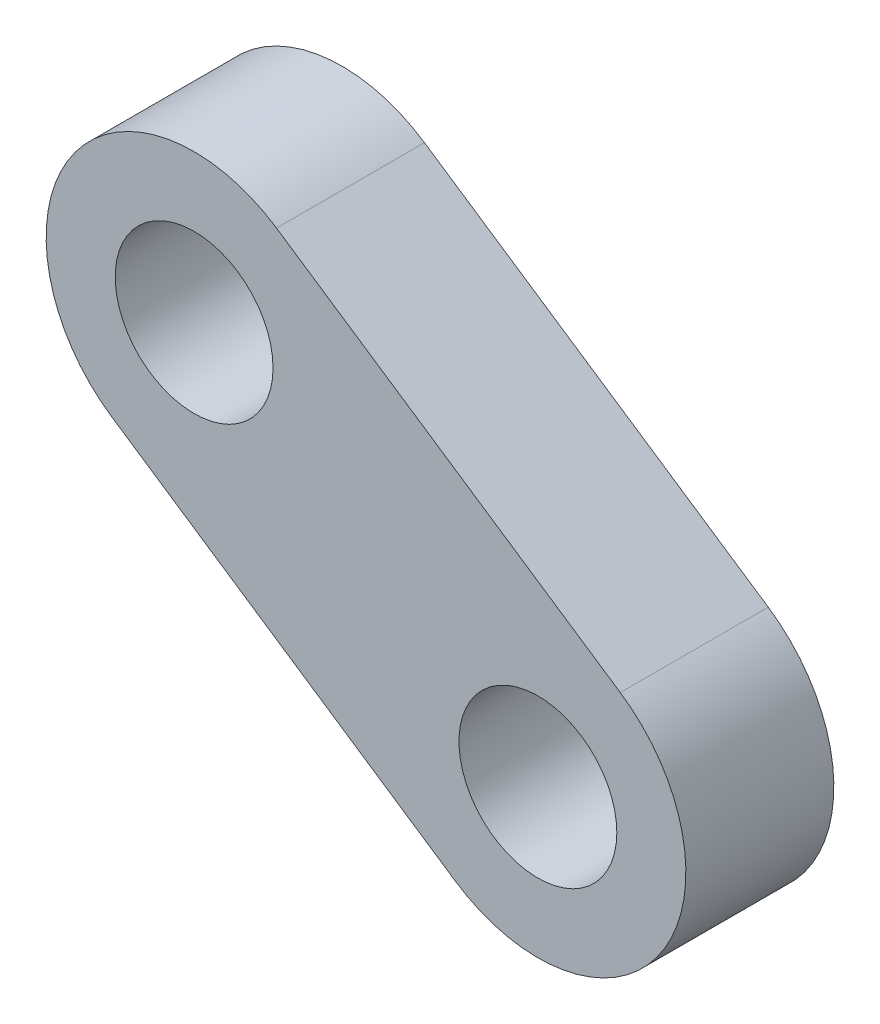
ISO-10303-21;
HEADER;
FILE_DESCRIPTION(('STEP AP214'),'2;1');
FILE_NAME('part.step','',(''),(''),'','','');
FILE_SCHEMA(('AUTOMOTIVE_DESIGN { 1 0 10303 214 1 1 1 1 }'));
ENDSEC;
DATA;
#1=APPLICATION_CONTEXT('core data for automotive mechanical design processes');
#2=APPLICATION_PROTOCOL_DEFINITION('international standard','automotive_design',2000,#1);
#3=PRODUCT_CONTEXT('',#1,'mechanical');
#4=PRODUCT('Part','Part','',(#3));
#5=PRODUCT_RELATED_PRODUCT_CATEGORY('part','',(#4));
#6=PRODUCT_DEFINITION_FORMATION('','',#4);
#7=PRODUCT_DEFINITION_CONTEXT('part definition',#1,'design');
#8=PRODUCT_DEFINITION('design','',#6,#7);
#9=PRODUCT_DEFINITION_SHAPE('','',#8);
#10=(LENGTH_UNIT() NAMED_UNIT(*) SI_UNIT(.MILLI.,.METRE.));
#11=(NAMED_UNIT(*) PLANE_ANGLE_UNIT() SI_UNIT($,.RADIAN.));
#12=(NAMED_UNIT(*) SI_UNIT($,.STERADIAN.) SOLID_ANGLE_UNIT());
#13=UNCERTAINTY_MEASURE_WITH_UNIT(LENGTH_MEASURE(1.E-05),#10,'distance_accuracy_value','');
#14=(GEOMETRIC_REPRESENTATION_CONTEXT(3) GLOBAL_UNCERTAINTY_ASSIGNED_CONTEXT((#13)) GLOBAL_UNIT_ASSIGNED_CONTEXT((#10,
#11,#12)) REPRESENTATION_CONTEXT('',''));
#15=CARTESIAN_POINT('',(0.,0.,0.));
#16=DIRECTION('',(0.,0.,1.));
#17=DIRECTION('',(1.,0.,0.));
#18=AXIS2_PLACEMENT_3D('',#15,#16,#17);
#19=CARTESIAN_POINT('',(-19.2257103498803,30.2429621303856,3.));
#20=DIRECTION('',(0.,0.,1.));
#21=DIRECTION('',(1.,0.,0.));
#22=AXIS2_PLACEMENT_3D('',#19,#20,#21);
#23=PLANE('',#22);
#24=CARTESIAN_POINT('',(-19.2257103498803,30.2429621303856,3.));
#25=DIRECTION('',(0.,0.,1.));
#26=DIRECTION('',(1.,0.,0.));
#27=AXIS2_PLACEMENT_3D('',#24,#25,#26);
#28=CIRCLE('',#27,1.6);
#29=CARTESIAN_POINT('',(-17.6257103498803,30.2429621303856,3.));
#30=VERTEX_POINT('',#29);
#31=EDGE_CURVE('E98',#30,#30,#28,.T.);
#32=ORIENTED_EDGE('',*,*,#31,.F.);
#33=EDGE_LOOP('',(#32));
#34=FACE_BOUND('',#33,.T.);
#35=CARTESIAN_POINT('',(-19.2257103498803,30.2429621303856,3.));
#36=DIRECTION('',(0.,0.,1.));
#37=DIRECTION('',(1.,0.,0.));
#38=AXIS2_PLACEMENT_3D('',#35,#36,#37);
#39=CIRCLE('',#38,3.);
#40=CARTESIAN_POINT('',(-17.5555837612578,32.7350851566378,3.));
#41=VERTEX_POINT('',#40);
#42=CARTESIAN_POINT('',(-20.8958369385028,27.7508391041335,3.));
#43=VERTEX_POINT('',#42);
#44=EDGE_CURVE('E83',#41,#43,#39,.T.);
#45=ORIENTED_EDGE('',*,*,#44,.T.);
#46=DIRECTION('',(0.830707675417386,-0.556708862874162,0.));
#47=VECTOR('',#46,1.);
#48=CARTESIAN_POINT('',(-20.8958369385028,27.7508391041335,3.));
#49=LINE('',#48,#47);
#50=CARTESIAN_POINT('',(-13.9263066283848,23.0801235100308,3.));
#51=VERTEX_POINT('',#50);
#52=EDGE_CURVE('E78',#43,#51,#49,.T.);
#53=ORIENTED_EDGE('',*,*,#52,.T.);
#54=CARTESIAN_POINT('',(-12.2561800397623,25.5722465362829,3.));
#55=DIRECTION('',(0.,0.,1.));
#56=DIRECTION('',(1.,0.,0.));
#57=AXIS2_PLACEMENT_3D('',#54,#55,#56);
#58=CIRCLE('',#57,3.);
#59=CARTESIAN_POINT('',(-10.5860534511399,28.0643695625351,3.));
#60=VERTEX_POINT('',#59);
#61=EDGE_CURVE('E81',#51,#60,#58,.T.);
#62=ORIENTED_EDGE('',*,*,#61,.T.);
#63=DIRECTION('',(-0.830707675417386,0.556708862874162,0.));
#64=VECTOR('',#63,1.);
#65=CARTESIAN_POINT('',(-17.5555837612578,32.7350851566378,3.));
#66=LINE('',#65,#64);
#67=EDGE_CURVE('E48',#60,#41,#66,.T.);
#68=ORIENTED_EDGE('',*,*,#67,.T.);
#69=EDGE_LOOP('',(#45,#53,#62,#68));
#70=FACE_BOUND('',#69,.T.);
#71=CARTESIAN_POINT('',(-12.2561800397623,25.5722465362829,3.));
#72=DIRECTION('',(0.,0.,1.));
#73=DIRECTION('',(1.,0.,0.));
#74=AXIS2_PLACEMENT_3D('',#71,#72,#73);
#75=CIRCLE('',#74,1.6);
#76=CARTESIAN_POINT('',(-10.6561800397623,25.5722465362829,3.));
#77=VERTEX_POINT('',#76);
#78=EDGE_CURVE('E113',#77,#77,#75,.T.);
#79=ORIENTED_EDGE('',*,*,#78,.F.);
#80=EDGE_LOOP('',(#79));
#81=FACE_BOUND('',#80,.T.);
#82=ADVANCED_FACE('F31',(#34,#70,#81),#23,.T.);
#83=CARTESIAN_POINT('',(-19.2257103498803,30.2429621303856,0.));
#84=DIRECTION('',(0.,0.,1.));
#85=DIRECTION('',(1.,0.,0.));
#86=AXIS2_PLACEMENT_3D('',#83,#84,#85);
#87=PLANE('',#86);
#88=CARTESIAN_POINT('',(-19.2257103498803,30.2429621303856,0.));
#89=DIRECTION('',(0.,0.,1.));
#90=DIRECTION('',(1.,0.,0.));
#91=AXIS2_PLACEMENT_3D('',#88,#89,#90);
#92=CIRCLE('',#91,3.);
#93=CARTESIAN_POINT('',(-17.5555837612578,32.7350851566378,0.));
#94=VERTEX_POINT('',#93);
#95=CARTESIAN_POINT('',(-20.8958369385028,27.7508391041335,0.));
#96=VERTEX_POINT('',#95);
#97=EDGE_CURVE('E95',#94,#96,#92,.T.);
#98=ORIENTED_EDGE('',*,*,#97,.F.);
#99=DIRECTION('',(-0.830707675417386,0.556708862874162,0.));
#100=VECTOR('',#99,1.);
#101=CARTESIAN_POINT('',(-17.5555837612578,32.7350851566378,0.));
#102=LINE('',#101,#100);
#103=CARTESIAN_POINT('',(-10.5860534511399,28.0643695625351,0.));
#104=VERTEX_POINT('',#103);
#105=EDGE_CURVE('E71',#104,#94,#102,.T.);
#106=ORIENTED_EDGE('',*,*,#105,.F.);
#107=CARTESIAN_POINT('',(-12.2561800397623,25.5722465362829,0.));
#108=DIRECTION('',(0.,0.,1.));
#109=DIRECTION('',(1.,0.,0.));
#110=AXIS2_PLACEMENT_3D('',#107,#108,#109);
#111=CIRCLE('',#110,3.);
#112=CARTESIAN_POINT('',(-13.9263066283848,23.0801235100308,0.));
#113=VERTEX_POINT('',#112);
#114=EDGE_CURVE('E65',#113,#104,#111,.T.);
#115=ORIENTED_EDGE('',*,*,#114,.F.);
#116=DIRECTION('',(0.830707675417386,-0.556708862874162,0.));
#117=VECTOR('',#116,1.);
#118=CARTESIAN_POINT('',(-20.8958369385028,27.7508391041335,0.));
#119=LINE('',#118,#117);
#120=EDGE_CURVE('E87',#96,#113,#119,.T.);
#121=ORIENTED_EDGE('',*,*,#120,.F.);
#122=EDGE_LOOP('',(#98,#106,#115,#121));
#123=FACE_BOUND('',#122,.T.);
#124=CARTESIAN_POINT('',(-19.2257103498803,30.2429621303856,0.));
#125=DIRECTION('',(0.,0.,1.));
#126=DIRECTION('',(1.,0.,0.));
#127=AXIS2_PLACEMENT_3D('',#124,#125,#126);
#128=CIRCLE('',#127,1.6);
#129=CARTESIAN_POINT('',(-17.6257103498803,30.2429621303856,0.));
#130=VERTEX_POINT('',#129);
#131=EDGE_CURVE('E110',#130,#130,#128,.T.);
#132=ORIENTED_EDGE('',*,*,#131,.T.);
#133=EDGE_LOOP('',(#132));
#134=FACE_BOUND('',#133,.T.);
#135=CARTESIAN_POINT('',(-12.2561800397623,25.5722465362829,0.));
#136=DIRECTION('',(0.,0.,1.));
#137=DIRECTION('',(1.,0.,0.));
#138=AXIS2_PLACEMENT_3D('',#135,#136,#137);
#139=CIRCLE('',#138,1.6);
#140=CARTESIAN_POINT('',(-10.6561800397623,25.5722465362829,0.));
#141=VERTEX_POINT('',#140);
#142=EDGE_CURVE('E116',#141,#141,#139,.T.);
#143=ORIENTED_EDGE('',*,*,#142,.T.);
#144=EDGE_LOOP('',(#143));
#145=FACE_BOUND('',#144,.T.);
#146=ADVANCED_FACE('F106',(#123,#134,#145),#87,.F.);
#147=CARTESIAN_POINT('',(-19.2257103498803,30.2429621303856,3.));
#148=DIRECTION('',(0.,0.,-1.));
#149=DIRECTION('',(-1.,0.,0.));
#150=AXIS2_PLACEMENT_3D('',#147,#148,#149);
#151=CYLINDRICAL_SURFACE('',#150,3.);
#152=ORIENTED_EDGE('',*,*,#97,.T.);
#153=DIRECTION('',(0.,0.,-1.));
#154=VECTOR('',#153,1.);
#155=CARTESIAN_POINT('',(-20.8958369385028,27.7508391041335,3.));
#156=LINE('',#155,#154);
#157=EDGE_CURVE('E11',#43,#96,#156,.T.);
#158=ORIENTED_EDGE('',*,*,#157,.F.);
#159=ORIENTED_EDGE('',*,*,#44,.F.);
#160=DIRECTION('',(0.,0.,-1.));
#161=VECTOR('',#160,1.);
#162=CARTESIAN_POINT('',(-17.5555837612578,32.7350851566378,3.));
#163=LINE('',#162,#161);
#164=EDGE_CURVE('E91',#41,#94,#163,.T.);
#165=ORIENTED_EDGE('',*,*,#164,.T.);
#166=EDGE_LOOP('',(#152,#158,#159,#165));
#167=FACE_BOUND('',#166,.T.);
#168=ADVANCED_FACE('F33',(#167),#151,.T.);
#169=CARTESIAN_POINT('',(-20.8958369385028,27.7508391041335,3.));
#170=DIRECTION('',(0.556708862874162,0.830707675417386,0.));
#171=DIRECTION('',(-0.830707675417386,0.556708862874162,0.));
#172=AXIS2_PLACEMENT_3D('',#169,#170,#171);
#173=PLANE('',#172);
#174=ORIENTED_EDGE('',*,*,#120,.T.);
#175=DIRECTION('',(0.,0.,-1.));
#176=VECTOR('',#175,1.);
#177=CARTESIAN_POINT('',(-13.9263066283848,23.0801235100308,3.));
#178=LINE('',#177,#176);
#179=EDGE_CURVE('E40',#51,#113,#178,.T.);
#180=ORIENTED_EDGE('',*,*,#179,.F.);
#181=ORIENTED_EDGE('',*,*,#52,.F.);
#182=ORIENTED_EDGE('',*,*,#157,.T.);
#183=EDGE_LOOP('',(#174,#180,#181,#182));
#184=FACE_BOUND('',#183,.T.);
#185=ADVANCED_FACE('F86',(#184),#173,.F.);
#186=CARTESIAN_POINT('',(-12.2561800397623,25.5722465362829,3.));
#187=DIRECTION('',(0.,0.,-1.));
#188=DIRECTION('',(-1.,0.,0.));
#189=AXIS2_PLACEMENT_3D('',#186,#187,#188);
#190=CYLINDRICAL_SURFACE('',#189,3.);
#191=ORIENTED_EDGE('',*,*,#114,.T.);
#192=DIRECTION('',(0.,0.,-1.));
#193=VECTOR('',#192,1.);
#194=CARTESIAN_POINT('',(-10.5860534511399,28.0643695625351,3.));
#195=LINE('',#194,#193);
#196=EDGE_CURVE('E88',#60,#104,#195,.T.);
#197=ORIENTED_EDGE('',*,*,#196,.F.);
#198=ORIENTED_EDGE('',*,*,#61,.F.);
#199=ORIENTED_EDGE('',*,*,#179,.T.);
#200=EDGE_LOOP('',(#191,#197,#198,#199));
#201=FACE_BOUND('',#200,.T.);
#202=ADVANCED_FACE('F89',(#201),#190,.T.);
#203=CARTESIAN_POINT('',(-17.5555837612578,32.7350851566378,3.));
#204=DIRECTION('',(-0.556708862874162,-0.830707675417386,0.));
#205=DIRECTION('',(0.830707675417386,-0.556708862874162,0.));
#206=AXIS2_PLACEMENT_3D('',#203,#204,#205);
#207=PLANE('',#206);
#208=ORIENTED_EDGE('',*,*,#105,.T.);
#209=ORIENTED_EDGE('',*,*,#164,.F.);
#210=ORIENTED_EDGE('',*,*,#67,.F.);
#211=ORIENTED_EDGE('',*,*,#196,.T.);
#212=EDGE_LOOP('',(#208,#209,#210,#211));
#213=FACE_BOUND('',#212,.T.);
#214=ADVANCED_FACE('F103',(#213),#207,.F.);
#215=CARTESIAN_POINT('',(-19.2257103498803,30.2429621303856,3.));
#216=DIRECTION('',(0.,0.,-1.));
#217=DIRECTION('',(-1.,0.,0.));
#218=AXIS2_PLACEMENT_3D('',#215,#216,#217);
#219=CYLINDRICAL_SURFACE('',#218,1.6);
#220=ORIENTED_EDGE('',*,*,#31,.T.);
#221=EDGE_LOOP('',(#220));
#222=FACE_BOUND('',#221,.T.);
#223=ORIENTED_EDGE('',*,*,#131,.F.);
#224=EDGE_LOOP('',(#223));
#225=FACE_BOUND('',#224,.T.);
#226=ADVANCED_FACE('F133',(#222,#225),#219,.F.);
#227=CARTESIAN_POINT('',(-12.2561800397623,25.5722465362829,3.));
#228=DIRECTION('',(0.,0.,-1.));
#229=DIRECTION('',(-1.,0.,0.));
#230=AXIS2_PLACEMENT_3D('',#227,#228,#229);
#231=CYLINDRICAL_SURFACE('',#230,1.6);
#232=ORIENTED_EDGE('',*,*,#78,.T.);
#233=EDGE_LOOP('',(#232));
#234=FACE_BOUND('',#233,.T.);
#235=ORIENTED_EDGE('',*,*,#142,.F.);
#236=EDGE_LOOP('',(#235));
#237=FACE_BOUND('',#236,.T.);
#238=ADVANCED_FACE('F122',(#234,#237),#231,.F.);
#239=CLOSED_SHELL('',(#82,#146,#168,#185,#202,#214,#226,#238));
#240=MANIFOLD_SOLID_BREP('B2',#239);
#241=ADVANCED_BREP_SHAPE_REPRESENTATION('',(#18,#240),#14);
#242=SHAPE_DEFINITION_REPRESENTATION(#9,#241);
ENDSEC;
END-ISO-10303-21;
